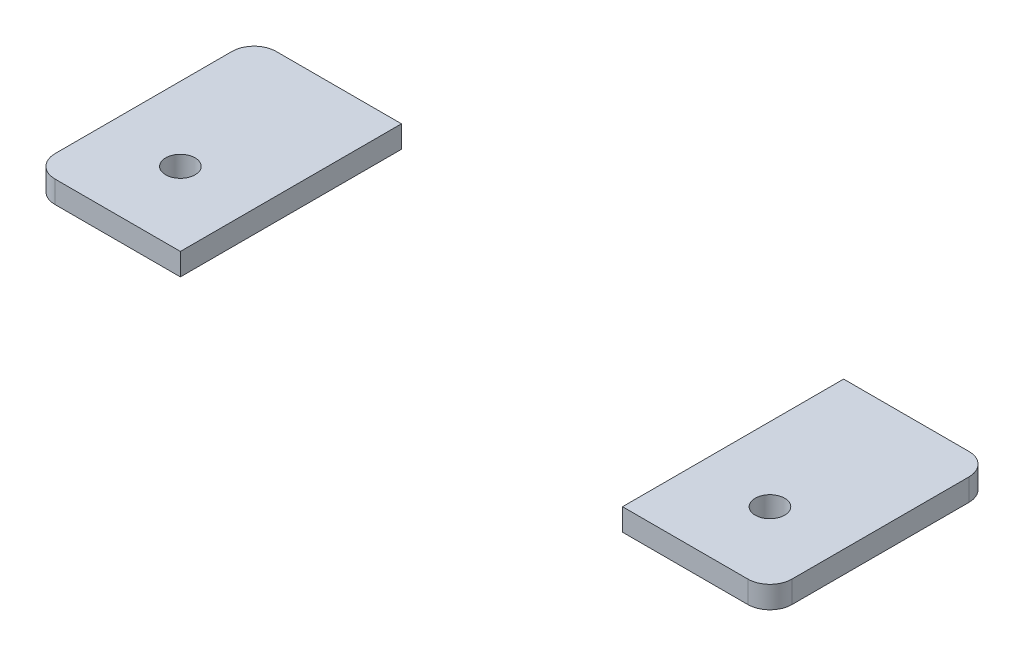
ISO-10303-21;
HEADER;
FILE_DESCRIPTION(('STEP AP214'),'2;1');
FILE_NAME('part.step','',(''),(''),'','','');
FILE_SCHEMA(('AUTOMOTIVE_DESIGN { 1 0 10303 214 1 1 1 1 }'));
ENDSEC;
DATA;
#1=APPLICATION_CONTEXT('core data for automotive mechanical design processes');
#2=APPLICATION_PROTOCOL_DEFINITION('international standard','automotive_design',2000,#1);
#3=PRODUCT_CONTEXT('',#1,'mechanical');
#4=PRODUCT('Part','Part','',(#3));
#5=PRODUCT_RELATED_PRODUCT_CATEGORY('part','',(#4));
#6=PRODUCT_DEFINITION_FORMATION('','',#4);
#7=PRODUCT_DEFINITION_CONTEXT('part definition',#1,'design');
#8=PRODUCT_DEFINITION('design','',#6,#7);
#9=PRODUCT_DEFINITION_SHAPE('','',#8);
#10=(LENGTH_UNIT() NAMED_UNIT(*) SI_UNIT(.MILLI.,.METRE.));
#11=(NAMED_UNIT(*) PLANE_ANGLE_UNIT() SI_UNIT($,.RADIAN.));
#12=(NAMED_UNIT(*) SI_UNIT($,.STERADIAN.) SOLID_ANGLE_UNIT());
#13=UNCERTAINTY_MEASURE_WITH_UNIT(LENGTH_MEASURE(1.E-05),#10,'distance_accuracy_value','');
#14=(GEOMETRIC_REPRESENTATION_CONTEXT(3) GLOBAL_UNCERTAINTY_ASSIGNED_CONTEXT((#13)) GLOBAL_UNIT_ASSIGNED_CONTEXT((#10,
#11,#12)) REPRESENTATION_CONTEXT('',''));
#15=CARTESIAN_POINT('',(0.,0.,0.));
#16=DIRECTION('',(0.,0.,1.));
#17=DIRECTION('',(1.,0.,0.));
#18=AXIS2_PLACEMENT_3D('',#15,#16,#17);
#19=CARTESIAN_POINT('',(47.,3.,12.));
#20=DIRECTION('',(0.,1.,0.));
#21=DIRECTION('',(0.,0.,1.));
#22=AXIS2_PLACEMENT_3D('',#19,#20,#21);
#23=PLANE('',#22);
#24=CARTESIAN_POINT('',(47.,3.,12.));
#25=DIRECTION('',(0.,1.,0.));
#26=DIRECTION('',(0.,0.,1.));
#27=AXIS2_PLACEMENT_3D('',#24,#25,#26);
#28=CIRCLE('',#27,3.);
#29=CARTESIAN_POINT('',(47.,3.,15.));
#30=VERTEX_POINT('',#29);
#31=CARTESIAN_POINT('',(50.,3.,12.));
#32=VERTEX_POINT('',#31);
#33=EDGE_CURVE('E173',#30,#32,#28,.T.);
#34=ORIENTED_EDGE('',*,*,#33,.T.);
#35=DIRECTION('',(0.,0.,-1.));
#36=VECTOR('',#35,1.);
#37=CARTESIAN_POINT('',(50.,3.,12.));
#38=LINE('',#37,#36);
#39=CARTESIAN_POINT('',(50.,3.,-12.));
#40=VERTEX_POINT('',#39);
#41=EDGE_CURVE('E115',#32,#40,#38,.T.);
#42=ORIENTED_EDGE('',*,*,#41,.T.);
#43=CARTESIAN_POINT('',(47.,3.,-12.));
#44=DIRECTION('',(0.,-1.,0.));
#45=DIRECTION('',(0.,0.,-1.));
#46=AXIS2_PLACEMENT_3D('',#43,#44,#45);
#47=CIRCLE('',#46,3.);
#48=CARTESIAN_POINT('',(47.,3.,-15.));
#49=VERTEX_POINT('',#48);
#50=EDGE_CURVE('E170',#49,#40,#47,.T.);
#51=ORIENTED_EDGE('',*,*,#50,.F.);
#52=DIRECTION('',(1.,0.,0.));
#53=VECTOR('',#52,1.);
#54=CARTESIAN_POINT('',(30.,3.,-15.));
#55=LINE('',#54,#53);
#56=CARTESIAN_POINT('',(30.,3.,-15.));
#57=VERTEX_POINT('',#56);
#58=EDGE_CURVE('E143',#57,#49,#55,.T.);
#59=ORIENTED_EDGE('',*,*,#58,.F.);
#60=DIRECTION('',(0.,0.,1.));
#61=VECTOR('',#60,1.);
#62=CARTESIAN_POINT('',(30.,3.,-15.));
#63=LINE('',#62,#61);
#64=CARTESIAN_POINT('',(30.,3.,15.));
#65=VERTEX_POINT('',#64);
#66=EDGE_CURVE('E166',#57,#65,#63,.T.);
#67=ORIENTED_EDGE('',*,*,#66,.T.);
#68=DIRECTION('',(1.,0.,0.));
#69=VECTOR('',#68,1.);
#70=CARTESIAN_POINT('',(30.,3.,15.));
#71=LINE('',#70,#69);
#72=EDGE_CURVE('E164',#65,#30,#71,.T.);
#73=ORIENTED_EDGE('',*,*,#72,.T.);
#74=EDGE_LOOP('',(#34,#42,#51,#59,#67,#73));
#75=FACE_BOUND('',#74,.T.);
#76=CARTESIAN_POINT('',(40.,3.,5.));
#77=DIRECTION('',(0.,1.,0.));
#78=DIRECTION('',(0.,0.,1.));
#79=AXIS2_PLACEMENT_3D('',#76,#77,#78);
#80=CIRCLE('',#79,2.);
#81=CARTESIAN_POINT('',(40.,3.,7.));
#82=VERTEX_POINT('',#81);
#83=EDGE_CURVE('E78',#82,#82,#80,.T.);
#84=ORIENTED_EDGE('',*,*,#83,.F.);
#85=EDGE_LOOP('',(#84));
#86=FACE_BOUND('',#85,.T.);
#87=ADVANCED_FACE('F74',(#75,#86),#23,.T.);
#88=CARTESIAN_POINT('',(47.,0.,12.));
#89=DIRECTION('',(0.,1.,0.));
#90=DIRECTION('',(0.,0.,1.));
#91=AXIS2_PLACEMENT_3D('',#88,#89,#90);
#92=PLANE('',#91);
#93=CARTESIAN_POINT('',(47.,0.,12.));
#94=DIRECTION('',(0.,1.,0.));
#95=DIRECTION('',(0.,0.,1.));
#96=AXIS2_PLACEMENT_3D('',#93,#94,#95);
#97=CIRCLE('',#96,3.);
#98=CARTESIAN_POINT('',(47.,0.,15.));
#99=VERTEX_POINT('',#98);
#100=CARTESIAN_POINT('',(50.,0.,12.));
#101=VERTEX_POINT('',#100);
#102=EDGE_CURVE('E161',#99,#101,#97,.T.);
#103=ORIENTED_EDGE('',*,*,#102,.F.);
#104=DIRECTION('',(1.,0.,0.));
#105=VECTOR('',#104,1.);
#106=CARTESIAN_POINT('',(30.,0.,15.));
#107=LINE('',#106,#105);
#108=CARTESIAN_POINT('',(30.,0.,15.));
#109=VERTEX_POINT('',#108);
#110=EDGE_CURVE('E126',#109,#99,#107,.T.);
#111=ORIENTED_EDGE('',*,*,#110,.F.);
#112=DIRECTION('',(0.,0.,1.));
#113=VECTOR('',#112,1.);
#114=CARTESIAN_POINT('',(30.,0.,-15.));
#115=LINE('',#114,#113);
#116=CARTESIAN_POINT('',(30.,0.,-15.));
#117=VERTEX_POINT('',#116);
#118=EDGE_CURVE('E155',#117,#109,#115,.T.);
#119=ORIENTED_EDGE('',*,*,#118,.F.);
#120=DIRECTION('',(1.,0.,0.));
#121=VECTOR('',#120,1.);
#122=CARTESIAN_POINT('',(30.,0.,-15.));
#123=LINE('',#122,#121);
#124=CARTESIAN_POINT('',(47.,0.,-15.));
#125=VERTEX_POINT('',#124);
#126=EDGE_CURVE('E141',#117,#125,#123,.T.);
#127=ORIENTED_EDGE('',*,*,#126,.T.);
#128=CARTESIAN_POINT('',(47.,0.,-12.));
#129=DIRECTION('',(0.,-1.,0.));
#130=DIRECTION('',(0.,0.,-1.));
#131=AXIS2_PLACEMENT_3D('',#128,#129,#130);
#132=CIRCLE('',#131,3.);
#133=CARTESIAN_POINT('',(50.,0.,-12.));
#134=VERTEX_POINT('',#133);
#135=EDGE_CURVE('E149',#125,#134,#132,.T.);
#136=ORIENTED_EDGE('',*,*,#135,.T.);
#137=DIRECTION('',(0.,0.,-1.));
#138=VECTOR('',#137,1.);
#139=CARTESIAN_POINT('',(50.,0.,12.));
#140=LINE('',#139,#138);
#141=EDGE_CURVE('E91',#101,#134,#140,.T.);
#142=ORIENTED_EDGE('',*,*,#141,.F.);
#143=EDGE_LOOP('',(#103,#111,#119,#127,#136,#142));
#144=FACE_BOUND('',#143,.T.);
#145=CARTESIAN_POINT('',(40.,0.,5.));
#146=DIRECTION('',(0.,1.,0.));
#147=DIRECTION('',(0.,0.,1.));
#148=AXIS2_PLACEMENT_3D('',#145,#146,#147);
#149=CIRCLE('',#148,2.);
#150=CARTESIAN_POINT('',(40.,0.,7.));
#151=VERTEX_POINT('',#150);
#152=EDGE_CURVE('E13',#151,#151,#149,.T.);
#153=ORIENTED_EDGE('',*,*,#152,.T.);
#154=EDGE_LOOP('',(#153));
#155=FACE_BOUND('',#154,.T.);
#156=ADVANCED_FACE('F153',(#144,#155),#92,.F.);
#157=CARTESIAN_POINT('',(47.,3.,12.));
#158=DIRECTION('',(0.,-1.,0.));
#159=DIRECTION('',(0.,0.,-1.));
#160=AXIS2_PLACEMENT_3D('',#157,#158,#159);
#161=CYLINDRICAL_SURFACE('',#160,3.);
#162=ORIENTED_EDGE('',*,*,#102,.T.);
#163=DIRECTION('',(0.,-1.,0.));
#164=VECTOR('',#163,1.);
#165=CARTESIAN_POINT('',(50.,3.,12.));
#166=LINE('',#165,#164);
#167=EDGE_CURVE('E182',#32,#101,#166,.T.);
#168=ORIENTED_EDGE('',*,*,#167,.F.);
#169=ORIENTED_EDGE('',*,*,#33,.F.);
#170=DIRECTION('',(0.,-1.,0.));
#171=VECTOR('',#170,1.);
#172=CARTESIAN_POINT('',(47.,3.,15.));
#173=LINE('',#172,#171);
#174=EDGE_CURVE('E167',#30,#99,#173,.T.);
#175=ORIENTED_EDGE('',*,*,#174,.T.);
#176=EDGE_LOOP('',(#162,#168,#169,#175));
#177=FACE_BOUND('',#176,.T.);
#178=ADVANCED_FACE('F185',(#177),#161,.T.);
#179=CARTESIAN_POINT('',(50.,3.,12.));
#180=DIRECTION('',(-1.,0.,0.));
#181=DIRECTION('',(0.,0.,1.));
#182=AXIS2_PLACEMENT_3D('',#179,#180,#181);
#183=PLANE('',#182);
#184=ORIENTED_EDGE('',*,*,#141,.T.);
#185=DIRECTION('',(0.,-1.,0.));
#186=VECTOR('',#185,1.);
#187=CARTESIAN_POINT('',(50.,3.,-12.));
#188=LINE('',#187,#186);
#189=EDGE_CURVE('E147',#40,#134,#188,.T.);
#190=ORIENTED_EDGE('',*,*,#189,.F.);
#191=ORIENTED_EDGE('',*,*,#41,.F.);
#192=ORIENTED_EDGE('',*,*,#167,.T.);
#193=EDGE_LOOP('',(#184,#190,#191,#192));
#194=FACE_BOUND('',#193,.T.);
#195=ADVANCED_FACE('F183',(#194),#183,.F.);
#196=CARTESIAN_POINT('',(47.,3.,-12.));
#197=DIRECTION('',(0.,-1.,0.));
#198=DIRECTION('',(0.,0.,-1.));
#199=AXIS2_PLACEMENT_3D('',#196,#197,#198);
#200=CYLINDRICAL_SURFACE('',#199,3.);
#201=ORIENTED_EDGE('',*,*,#135,.F.);
#202=DIRECTION('',(0.,-1.,0.));
#203=VECTOR('',#202,1.);
#204=CARTESIAN_POINT('',(47.,3.,-15.));
#205=LINE('',#204,#203);
#206=EDGE_CURVE('E137',#49,#125,#205,.T.);
#207=ORIENTED_EDGE('',*,*,#206,.F.);
#208=ORIENTED_EDGE('',*,*,#50,.T.);
#209=ORIENTED_EDGE('',*,*,#189,.T.);
#210=EDGE_LOOP('',(#201,#207,#208,#209));
#211=FACE_BOUND('',#210,.T.);
#212=ADVANCED_FACE('F150',(#211),#200,.T.);
#213=CARTESIAN_POINT('',(30.,3.,-15.));
#214=DIRECTION('',(0.,0.,-1.));
#215=DIRECTION('',(-1.,0.,0.));
#216=AXIS2_PLACEMENT_3D('',#213,#214,#215);
#217=PLANE('',#216);
#218=ORIENTED_EDGE('',*,*,#126,.F.);
#219=DIRECTION('',(0.,-1.,0.));
#220=VECTOR('',#219,1.);
#221=CARTESIAN_POINT('',(30.,3.,-15.));
#222=LINE('',#221,#220);
#223=EDGE_CURVE('E146',#57,#117,#222,.T.);
#224=ORIENTED_EDGE('',*,*,#223,.F.);
#225=ORIENTED_EDGE('',*,*,#58,.T.);
#226=ORIENTED_EDGE('',*,*,#206,.T.);
#227=EDGE_LOOP('',(#218,#224,#225,#226));
#228=FACE_BOUND('',#227,.T.);
#229=ADVANCED_FACE('F139',(#228),#217,.T.);
#230=CARTESIAN_POINT('',(30.,3.,-15.));
#231=DIRECTION('',(1.,0.,0.));
#232=DIRECTION('',(0.,0.,-1.));
#233=AXIS2_PLACEMENT_3D('',#230,#231,#232);
#234=PLANE('',#233);
#235=ORIENTED_EDGE('',*,*,#118,.T.);
#236=DIRECTION('',(0.,-1.,0.));
#237=VECTOR('',#236,1.);
#238=CARTESIAN_POINT('',(30.,3.,15.));
#239=LINE('',#238,#237);
#240=EDGE_CURVE('E178',#65,#109,#239,.T.);
#241=ORIENTED_EDGE('',*,*,#240,.F.);
#242=ORIENTED_EDGE('',*,*,#66,.F.);
#243=ORIENTED_EDGE('',*,*,#223,.T.);
#244=EDGE_LOOP('',(#235,#241,#242,#243));
#245=FACE_BOUND('',#244,.T.);
#246=ADVANCED_FACE('F192',(#245),#234,.F.);
#247=CARTESIAN_POINT('',(30.,3.,15.));
#248=DIRECTION('',(0.,0.,-1.));
#249=DIRECTION('',(-1.,0.,0.));
#250=AXIS2_PLACEMENT_3D('',#247,#248,#249);
#251=PLANE('',#250);
#252=ORIENTED_EDGE('',*,*,#110,.T.);
#253=ORIENTED_EDGE('',*,*,#174,.F.);
#254=ORIENTED_EDGE('',*,*,#72,.F.);
#255=ORIENTED_EDGE('',*,*,#240,.T.);
#256=EDGE_LOOP('',(#252,#253,#254,#255));
#257=FACE_BOUND('',#256,.T.);
#258=ADVANCED_FACE('F187',(#257),#251,.F.);
#259=CARTESIAN_POINT('',(40.,3.,5.));
#260=DIRECTION('',(0.,-1.,0.));
#261=DIRECTION('',(0.,0.,-1.));
#262=AXIS2_PLACEMENT_3D('',#259,#260,#261);
#263=CYLINDRICAL_SURFACE('',#262,2.);
#264=ORIENTED_EDGE('',*,*,#83,.T.);
#265=EDGE_LOOP('',(#264));
#266=FACE_BOUND('',#265,.T.);
#267=ORIENTED_EDGE('',*,*,#152,.F.);
#268=EDGE_LOOP('',(#267));
#269=FACE_BOUND('',#268,.T.);
#270=ADVANCED_FACE('F76',(#266,#269),#263,.F.);
#271=CLOSED_SHELL('',(#87,#156,#178,#195,#212,#229,#246,#258,#270));
#272=MANIFOLD_SOLID_BREP('B2',#271);
#273=CARTESIAN_POINT('',(-47.,3.,12.));
#274=DIRECTION('',(0.,-1.,0.));
#275=DIRECTION('',(0.,0.,-1.));
#276=AXIS2_PLACEMENT_3D('',#273,#274,#275);
#277=CYLINDRICAL_SURFACE('',#276,3.);
#278=CARTESIAN_POINT('',(-47.,0.,12.));
#279=DIRECTION('',(0.,1.,0.));
#280=DIRECTION('',(0.,0.,1.));
#281=AXIS2_PLACEMENT_3D('',#278,#279,#280);
#282=CIRCLE('',#281,3.);
#283=CARTESIAN_POINT('',(-47.,0.,15.));
#284=VERTEX_POINT('',#283);
#285=CARTESIAN_POINT('',(-50.,0.,12.));
#286=VERTEX_POINT('',#285);
#287=EDGE_CURVE('E374',#284,#286,#282,.F.);
#288=ORIENTED_EDGE('',*,*,#287,.F.);
#289=DIRECTION('',(0.,-1.,0.));
#290=VECTOR('',#289,1.);
#291=CARTESIAN_POINT('',(-47.,3.,15.));
#292=LINE('',#291,#290);
#293=CARTESIAN_POINT('',(-47.,3.,15.));
#294=VERTEX_POINT('',#293);
#295=EDGE_CURVE('E72',#294,#284,#292,.T.);
#296=ORIENTED_EDGE('',*,*,#295,.F.);
#297=CARTESIAN_POINT('',(-47.,3.,12.));
#298=DIRECTION('',(0.,1.,0.));
#299=DIRECTION('',(0.,0.,1.));
#300=AXIS2_PLACEMENT_3D('',#297,#298,#299);
#301=CIRCLE('',#300,3.);
#302=CARTESIAN_POINT('',(-50.,3.,12.));
#303=VERTEX_POINT('',#302);
#304=EDGE_CURVE('E496',#294,#303,#301,.F.);
#305=ORIENTED_EDGE('',*,*,#304,.T.);
#306=DIRECTION('',(0.,-1.,0.));
#307=VECTOR('',#306,1.);
#308=CARTESIAN_POINT('',(-50.,3.,12.));
#309=LINE('',#308,#307);
#310=EDGE_CURVE('E306',#303,#286,#309,.T.);
#311=ORIENTED_EDGE('',*,*,#310,.T.);
#312=EDGE_LOOP('',(#288,#296,#305,#311));
#313=FACE_BOUND('',#312,.T.);
#314=ADVANCED_FACE('F289',(#313),#277,.T.);
#315=CARTESIAN_POINT('',(0.,3.,15.));
#316=DIRECTION('',(0.,0.,-1.));
#317=DIRECTION('',(-1.,0.,0.));
#318=AXIS2_PLACEMENT_3D('',#315,#316,#317);
#319=PLANE('',#318);
#320=DIRECTION('',(1.,0.,0.));
#321=VECTOR('',#320,1.);
#322=CARTESIAN_POINT('',(0.,0.,15.));
#323=LINE('',#322,#321);
#324=CARTESIAN_POINT('',(-30.,0.,15.));
#325=VERTEX_POINT('',#324);
#326=EDGE_CURVE('E376',#284,#325,#323,.T.);
#327=ORIENTED_EDGE('',*,*,#326,.T.);
#328=DIRECTION('',(0.,-1.,0.));
#329=VECTOR('',#328,1.);
#330=CARTESIAN_POINT('',(-30.,3.,15.));
#331=LINE('',#330,#329);
#332=CARTESIAN_POINT('',(-30.,3.,15.));
#333=VERTEX_POINT('',#332);
#334=EDGE_CURVE('E298',#333,#325,#331,.T.);
#335=ORIENTED_EDGE('',*,*,#334,.F.);
#336=DIRECTION('',(1.,0.,0.));
#337=VECTOR('',#336,1.);
#338=CARTESIAN_POINT('',(0.,3.,15.));
#339=LINE('',#338,#337);
#340=EDGE_CURVE('E498',#294,#333,#339,.T.);
#341=ORIENTED_EDGE('',*,*,#340,.F.);
#342=ORIENTED_EDGE('',*,*,#295,.T.);
#343=EDGE_LOOP('',(#327,#335,#341,#342));
#344=FACE_BOUND('',#343,.T.);
#345=ADVANCED_FACE('F397',(#344),#319,.F.);
#346=CARTESIAN_POINT('',(-30.,3.,0.));
#347=DIRECTION('',(1.,0.,0.));
#348=DIRECTION('',(0.,0.,-1.));
#349=AXIS2_PLACEMENT_3D('',#346,#347,#348);
#350=PLANE('',#349);
#351=DIRECTION('',(0.,0.,1.));
#352=VECTOR('',#351,1.);
#353=CARTESIAN_POINT('',(-30.,0.,0.));
#354=LINE('',#353,#352);
#355=CARTESIAN_POINT('',(-30.,0.,-15.));
#356=VERTEX_POINT('',#355);
#357=EDGE_CURVE('E379',#356,#325,#354,.T.);
#358=ORIENTED_EDGE('',*,*,#357,.F.);
#359=DIRECTION('',(0.,-1.,0.));
#360=VECTOR('',#359,1.);
#361=CARTESIAN_POINT('',(-30.,3.,-15.));
#362=LINE('',#361,#360);
#363=CARTESIAN_POINT('',(-30.,3.,-15.));
#364=VERTEX_POINT('',#363);
#365=EDGE_CURVE('E353',#364,#356,#362,.T.);
#366=ORIENTED_EDGE('',*,*,#365,.F.);
#367=DIRECTION('',(0.,0.,1.));
#368=VECTOR('',#367,1.);
#369=CARTESIAN_POINT('',(-30.,3.,0.));
#370=LINE('',#369,#368);
#371=EDGE_CURVE('E363',#364,#333,#370,.T.);
#372=ORIENTED_EDGE('',*,*,#371,.T.);
#373=ORIENTED_EDGE('',*,*,#334,.T.);
#374=EDGE_LOOP('',(#358,#366,#372,#373));
#375=FACE_BOUND('',#374,.T.);
#376=ADVANCED_FACE('F394',(#375),#350,.T.);
#377=CARTESIAN_POINT('',(0.,3.,-15.));
#378=DIRECTION('',(0.,0.,-1.));
#379=DIRECTION('',(-1.,0.,0.));
#380=AXIS2_PLACEMENT_3D('',#377,#378,#379);
#381=PLANE('',#380);
#382=DIRECTION('',(1.,0.,0.));
#383=VECTOR('',#382,1.);
#384=CARTESIAN_POINT('',(0.,0.,-15.));
#385=LINE('',#384,#383);
#386=CARTESIAN_POINT('',(-47.,0.,-15.));
#387=VERTEX_POINT('',#386);
#388=EDGE_CURVE('E349',#387,#356,#385,.T.);
#389=ORIENTED_EDGE('',*,*,#388,.F.);
#390=DIRECTION('',(0.,-1.,0.));
#391=VECTOR('',#390,1.);
#392=CARTESIAN_POINT('',(-47.,3.,-15.));
#393=LINE('',#392,#391);
#394=CARTESIAN_POINT('',(-47.,3.,-15.));
#395=VERTEX_POINT('',#394);
#396=EDGE_CURVE('E344',#395,#387,#393,.T.);
#397=ORIENTED_EDGE('',*,*,#396,.F.);
#398=DIRECTION('',(1.,0.,0.));
#399=VECTOR('',#398,1.);
#400=CARTESIAN_POINT('',(0.,3.,-15.));
#401=LINE('',#400,#399);
#402=EDGE_CURVE('E347',#395,#364,#401,.T.);
#403=ORIENTED_EDGE('',*,*,#402,.T.);
#404=ORIENTED_EDGE('',*,*,#365,.T.);
#405=EDGE_LOOP('',(#389,#397,#403,#404));
#406=FACE_BOUND('',#405,.T.);
#407=ADVANCED_FACE('F346',(#406),#381,.T.);
#408=CARTESIAN_POINT('',(-47.,3.,-12.));
#409=DIRECTION('',(0.,-1.,0.));
#410=DIRECTION('',(0.,0.,-1.));
#411=AXIS2_PLACEMENT_3D('',#408,#409,#410);
#412=CYLINDRICAL_SURFACE('',#411,3.);
#413=CARTESIAN_POINT('',(-47.,0.,-12.));
#414=DIRECTION('',(0.,1.,0.));
#415=DIRECTION('',(0.,0.,1.));
#416=AXIS2_PLACEMENT_3D('',#413,#414,#415);
#417=CIRCLE('',#416,3.);
#418=CARTESIAN_POINT('',(-50.,0.,-12.));
#419=VERTEX_POINT('',#418);
#420=EDGE_CURVE('E383',#419,#387,#417,.F.);
#421=ORIENTED_EDGE('',*,*,#420,.F.);
#422=DIRECTION('',(0.,-1.,0.));
#423=VECTOR('',#422,1.);
#424=CARTESIAN_POINT('',(-50.,3.,-12.));
#425=LINE('',#424,#423);
#426=CARTESIAN_POINT('',(-50.,3.,-12.));
#427=VERTEX_POINT('',#426);
#428=EDGE_CURVE('E325',#427,#419,#425,.T.);
#429=ORIENTED_EDGE('',*,*,#428,.F.);
#430=CARTESIAN_POINT('',(-47.,3.,-12.));
#431=DIRECTION('',(0.,1.,0.));
#432=DIRECTION('',(0.,0.,1.));
#433=AXIS2_PLACEMENT_3D('',#430,#431,#432);
#434=CIRCLE('',#433,3.);
#435=EDGE_CURVE('E361',#427,#395,#434,.F.);
#436=ORIENTED_EDGE('',*,*,#435,.T.);
#437=ORIENTED_EDGE('',*,*,#396,.T.);
#438=EDGE_LOOP('',(#421,#429,#436,#437));
#439=FACE_BOUND('',#438,.T.);
#440=ADVANCED_FACE('F365',(#439),#412,.T.);
#441=CARTESIAN_POINT('',(-40.,3.,5.));
#442=DIRECTION('',(0.,-1.,0.));
#443=DIRECTION('',(0.,0.,-1.));
#444=AXIS2_PLACEMENT_3D('',#441,#442,#443);
#445=CYLINDRICAL_SURFACE('',#444,2.);
#446=CARTESIAN_POINT('',(-40.,3.,5.));
#447=DIRECTION('',(0.,1.,0.));
#448=DIRECTION('',(0.,0.,1.));
#449=AXIS2_PLACEMENT_3D('',#446,#447,#448);
#450=CIRCLE('',#449,2.);
#451=CARTESIAN_POINT('',(-40.,3.,7.));
#452=VERTEX_POINT('',#451);
#453=EDGE_CURVE('E388',#452,#452,#450,.T.);
#454=ORIENTED_EDGE('',*,*,#453,.T.);
#455=EDGE_LOOP('',(#454));
#456=FACE_BOUND('',#455,.T.);
#457=CARTESIAN_POINT('',(-40.,0.,5.));
#458=DIRECTION('',(0.,1.,0.));
#459=DIRECTION('',(0.,0.,1.));
#460=AXIS2_PLACEMENT_3D('',#457,#458,#459);
#461=CIRCLE('',#460,2.);
#462=CARTESIAN_POINT('',(-40.,0.,7.));
#463=VERTEX_POINT('',#462);
#464=EDGE_CURVE('E371',#463,#463,#461,.T.);
#465=ORIENTED_EDGE('',*,*,#464,.F.);
#466=EDGE_LOOP('',(#465));
#467=FACE_BOUND('',#466,.T.);
#468=ADVANCED_FACE('F291',(#456,#467),#445,.F.);
#469=CARTESIAN_POINT('',(-50.,3.,0.));
#470=DIRECTION('',(-1.,0.,0.));
#471=DIRECTION('',(0.,0.,1.));
#472=AXIS2_PLACEMENT_3D('',#469,#470,#471);
#473=PLANE('',#472);
#474=DIRECTION('',(0.,0.,-1.));
#475=VECTOR('',#474,1.);
#476=CARTESIAN_POINT('',(-50.,0.,0.));
#477=LINE('',#476,#475);
#478=EDGE_CURVE('E385',#286,#419,#477,.T.);
#479=ORIENTED_EDGE('',*,*,#478,.F.);
#480=ORIENTED_EDGE('',*,*,#310,.F.);
#481=DIRECTION('',(0.,0.,-1.));
#482=VECTOR('',#481,1.);
#483=CARTESIAN_POINT('',(-50.,3.,0.));
#484=LINE('',#483,#482);
#485=EDGE_CURVE('E366',#303,#427,#484,.T.);
#486=ORIENTED_EDGE('',*,*,#485,.T.);
#487=ORIENTED_EDGE('',*,*,#428,.T.);
#488=EDGE_LOOP('',(#479,#480,#486,#487));
#489=FACE_BOUND('',#488,.T.);
#490=ADVANCED_FACE('F400',(#489),#473,.T.);
#491=CARTESIAN_POINT('',(0.,3.,0.));
#492=DIRECTION('',(0.,1.,0.));
#493=DIRECTION('',(0.,0.,1.));
#494=AXIS2_PLACEMENT_3D('',#491,#492,#493);
#495=PLANE('',#494);
#496=ORIENTED_EDGE('',*,*,#453,.F.);
#497=EDGE_LOOP('',(#496));
#498=FACE_BOUND('',#497,.T.);
#499=ORIENTED_EDGE('',*,*,#304,.F.);
#500=ORIENTED_EDGE('',*,*,#340,.T.);
#501=ORIENTED_EDGE('',*,*,#371,.F.);
#502=ORIENTED_EDGE('',*,*,#402,.F.);
#503=ORIENTED_EDGE('',*,*,#435,.F.);
#504=ORIENTED_EDGE('',*,*,#485,.F.);
#505=EDGE_LOOP('',(#499,#500,#501,#502,#503,#504));
#506=FACE_BOUND('',#505,.T.);
#507=ADVANCED_FACE('F359',(#498,#506),#495,.T.);
#508=CARTESIAN_POINT('',(0.,0.,0.));
#509=DIRECTION('',(0.,1.,0.));
#510=DIRECTION('',(0.,0.,1.));
#511=AXIS2_PLACEMENT_3D('',#508,#509,#510);
#512=PLANE('',#511);
#513=ORIENTED_EDGE('',*,*,#464,.T.);
#514=EDGE_LOOP('',(#513));
#515=FACE_BOUND('',#514,.T.);
#516=ORIENTED_EDGE('',*,*,#287,.T.);
#517=ORIENTED_EDGE('',*,*,#478,.T.);
#518=ORIENTED_EDGE('',*,*,#420,.T.);
#519=ORIENTED_EDGE('',*,*,#388,.T.);
#520=ORIENTED_EDGE('',*,*,#357,.T.);
#521=ORIENTED_EDGE('',*,*,#326,.F.);
#522=EDGE_LOOP('',(#516,#517,#518,#519,#520,#521));
#523=FACE_BOUND('',#522,.T.);
#524=ADVANCED_FACE('F399',(#515,#523),#512,.F.);
#525=CLOSED_SHELL('',(#314,#345,#376,#407,#440,#468,#490,#507,#524));
#526=MANIFOLD_SOLID_BREP('B7',#525);
#527=ADVANCED_BREP_SHAPE_REPRESENTATION('',(#18,#272,#526),#14);
#528=SHAPE_DEFINITION_REPRESENTATION(#9,#527);
ENDSEC;
END-ISO-10303-21;
